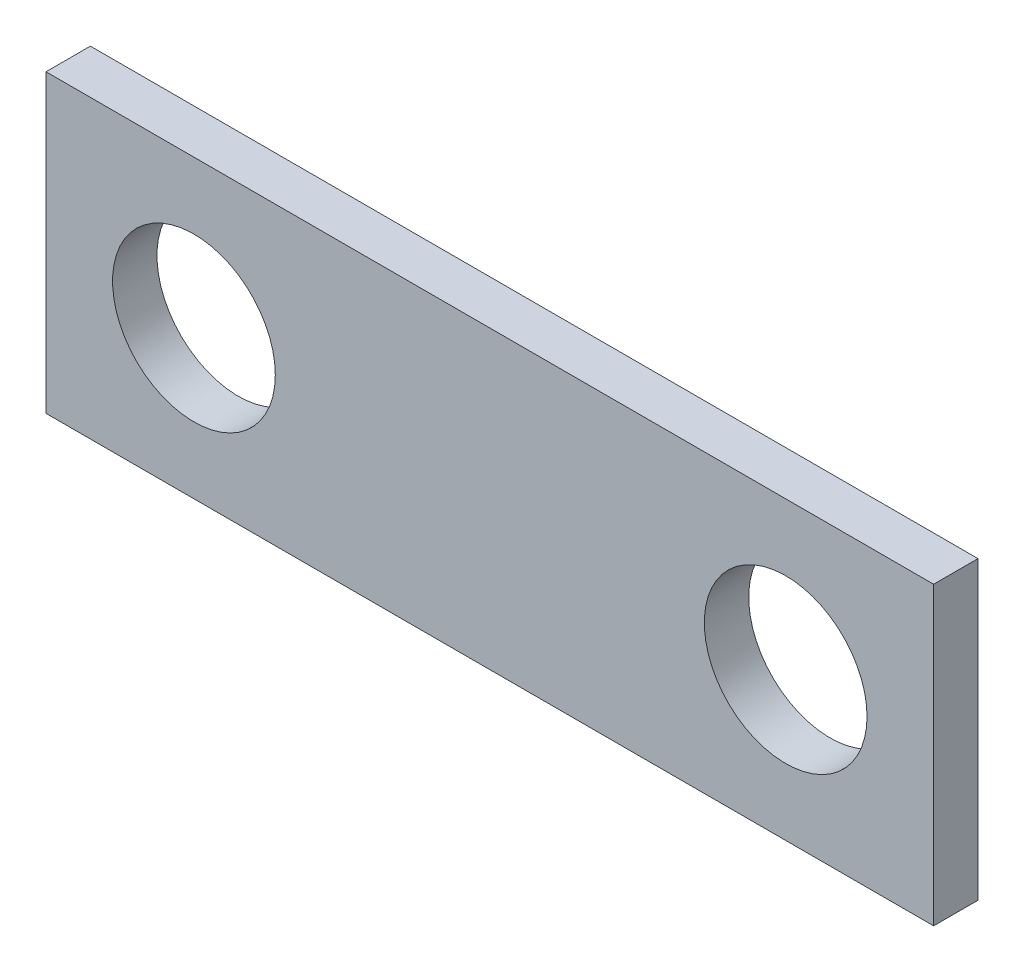
ISO-10303-21;
HEADER;
FILE_DESCRIPTION(('STEP AP214'),'2;1');
FILE_NAME('part.step','',(''),(''),'','','');
FILE_SCHEMA(('AUTOMOTIVE_DESIGN { 1 0 10303 214 1 1 1 1 }'));
ENDSEC;
DATA;
#1=APPLICATION_CONTEXT('core data for automotive mechanical design processes');
#2=APPLICATION_PROTOCOL_DEFINITION('international standard','automotive_design',2000,#1);
#3=PRODUCT_CONTEXT('',#1,'mechanical');
#4=PRODUCT('Part','Part','',(#3));
#5=PRODUCT_RELATED_PRODUCT_CATEGORY('part','',(#4));
#6=PRODUCT_DEFINITION_FORMATION('','',#4);
#7=PRODUCT_DEFINITION_CONTEXT('part definition',#1,'design');
#8=PRODUCT_DEFINITION('design','',#6,#7);
#9=PRODUCT_DEFINITION_SHAPE('','',#8);
#10=(LENGTH_UNIT() NAMED_UNIT(*) SI_UNIT(.MILLI.,.METRE.));
#11=(NAMED_UNIT(*) PLANE_ANGLE_UNIT() SI_UNIT($,.RADIAN.));
#12=(NAMED_UNIT(*) SI_UNIT($,.STERADIAN.) SOLID_ANGLE_UNIT());
#13=UNCERTAINTY_MEASURE_WITH_UNIT(LENGTH_MEASURE(1.E-05),#10,'distance_accuracy_value','');
#14=(GEOMETRIC_REPRESENTATION_CONTEXT(3) GLOBAL_UNCERTAINTY_ASSIGNED_CONTEXT((#13)) GLOBAL_UNIT_ASSIGNED_CONTEXT((#10,
#11,#12)) REPRESENTATION_CONTEXT('',''));
#15=CARTESIAN_POINT('',(0.,0.,0.));
#16=DIRECTION('',(0.,0.,1.));
#17=DIRECTION('',(1.,0.,0.));
#18=AXIS2_PLACEMENT_3D('',#15,#16,#17);
#19=CARTESIAN_POINT('',(30.,10.,3.));
#20=DIRECTION('',(-1.,0.,0.));
#21=DIRECTION('',(0.,0.,1.));
#22=AXIS2_PLACEMENT_3D('',#19,#20,#21);
#23=PLANE('',#22);
#24=DIRECTION('',(0.,1.,0.));
#25=VECTOR('',#24,1.);
#26=CARTESIAN_POINT('',(30.,10.,0.));
#27=LINE('',#26,#25);
#28=CARTESIAN_POINT('',(30.,-10.,0.));
#29=VERTEX_POINT('',#28);
#30=CARTESIAN_POINT('',(30.,10.,0.));
#31=VERTEX_POINT('',#30);
#32=EDGE_CURVE('E95',#29,#31,#27,.T.);
#33=ORIENTED_EDGE('',*,*,#32,.T.);
#34=DIRECTION('',(0.,0.,-1.));
#35=VECTOR('',#34,1.);
#36=CARTESIAN_POINT('',(30.,10.,3.));
#37=LINE('',#36,#35);
#38=CARTESIAN_POINT('',(30.,10.,3.));
#39=VERTEX_POINT('',#38);
#40=EDGE_CURVE('E11',#39,#31,#37,.T.);
#41=ORIENTED_EDGE('',*,*,#40,.F.);
#42=DIRECTION('',(0.,1.,0.));
#43=VECTOR('',#42,1.);
#44=CARTESIAN_POINT('',(30.,10.,3.));
#45=LINE('',#44,#43);
#46=CARTESIAN_POINT('',(30.,-10.,3.));
#47=VERTEX_POINT('',#46);
#48=EDGE_CURVE('E83',#47,#39,#45,.T.);
#49=ORIENTED_EDGE('',*,*,#48,.F.);
#50=DIRECTION('',(0.,0.,-1.));
#51=VECTOR('',#50,1.);
#52=CARTESIAN_POINT('',(30.,-10.,3.));
#53=LINE('',#52,#51);
#54=EDGE_CURVE('E91',#47,#29,#53,.T.);
#55=ORIENTED_EDGE('',*,*,#54,.T.);
#56=EDGE_LOOP('',(#33,#41,#49,#55));
#57=FACE_BOUND('',#56,.T.);
#58=ADVANCED_FACE('F32',(#57),#23,.F.);
#59=CARTESIAN_POINT('',(-30.,10.,3.));
#60=DIRECTION('',(0.,-1.,0.));
#61=DIRECTION('',(0.,0.,-1.));
#62=AXIS2_PLACEMENT_3D('',#59,#60,#61);
#63=PLANE('',#62);
#64=DIRECTION('',(-1.,0.,0.));
#65=VECTOR('',#64,1.);
#66=CARTESIAN_POINT('',(-30.,10.,0.));
#67=LINE('',#66,#65);
#68=CARTESIAN_POINT('',(-30.,10.,0.));
#69=VERTEX_POINT('',#68);
#70=EDGE_CURVE('E87',#31,#69,#67,.T.);
#71=ORIENTED_EDGE('',*,*,#70,.T.);
#72=DIRECTION('',(0.,0.,-1.));
#73=VECTOR('',#72,1.);
#74=CARTESIAN_POINT('',(-30.,10.,3.));
#75=LINE('',#74,#73);
#76=CARTESIAN_POINT('',(-30.,10.,3.));
#77=VERTEX_POINT('',#76);
#78=EDGE_CURVE('E40',#77,#69,#75,.T.);
#79=ORIENTED_EDGE('',*,*,#78,.F.);
#80=DIRECTION('',(-1.,0.,0.));
#81=VECTOR('',#80,1.);
#82=CARTESIAN_POINT('',(-30.,10.,3.));
#83=LINE('',#82,#81);
#84=EDGE_CURVE('E78',#39,#77,#83,.T.);
#85=ORIENTED_EDGE('',*,*,#84,.F.);
#86=ORIENTED_EDGE('',*,*,#40,.T.);
#87=EDGE_LOOP('',(#71,#79,#85,#86));
#88=FACE_BOUND('',#87,.T.);
#89=ADVANCED_FACE('F86',(#88),#63,.F.);
#90=CARTESIAN_POINT('',(-30.,10.,3.));
#91=DIRECTION('',(1.,0.,0.));
#92=DIRECTION('',(0.,1.,0.));
#93=AXIS2_PLACEMENT_3D('',#90,#91,#92);
#94=PLANE('',#93);
#95=DIRECTION('',(0.,-1.,0.));
#96=VECTOR('',#95,1.);
#97=CARTESIAN_POINT('',(-30.,10.,0.));
#98=LINE('',#97,#96);
#99=CARTESIAN_POINT('',(-30.,-10.,0.));
#100=VERTEX_POINT('',#99);
#101=EDGE_CURVE('E65',#69,#100,#98,.T.);
#102=ORIENTED_EDGE('',*,*,#101,.T.);
#103=DIRECTION('',(0.,0.,-1.));
#104=VECTOR('',#103,1.);
#105=CARTESIAN_POINT('',(-30.,-10.,3.));
#106=LINE('',#105,#104);
#107=CARTESIAN_POINT('',(-30.,-10.,3.));
#108=VERTEX_POINT('',#107);
#109=EDGE_CURVE('E88',#108,#100,#106,.T.);
#110=ORIENTED_EDGE('',*,*,#109,.F.);
#111=DIRECTION('',(0.,-1.,0.));
#112=VECTOR('',#111,1.);
#113=CARTESIAN_POINT('',(-30.,10.,3.));
#114=LINE('',#113,#112);
#115=EDGE_CURVE('E81',#77,#108,#114,.T.);
#116=ORIENTED_EDGE('',*,*,#115,.F.);
#117=ORIENTED_EDGE('',*,*,#78,.T.);
#118=EDGE_LOOP('',(#102,#110,#116,#117));
#119=FACE_BOUND('',#118,.T.);
#120=ADVANCED_FACE('F89',(#119),#94,.F.);
#121=CARTESIAN_POINT('',(-30.,-10.,3.));
#122=DIRECTION('',(0.,1.,0.));
#123=DIRECTION('',(0.,0.,1.));
#124=AXIS2_PLACEMENT_3D('',#121,#122,#123);
#125=PLANE('',#124);
#126=DIRECTION('',(1.,0.,0.));
#127=VECTOR('',#126,1.);
#128=CARTESIAN_POINT('',(-30.,-10.,0.));
#129=LINE('',#128,#127);
#130=EDGE_CURVE('E71',#100,#29,#129,.T.);
#131=ORIENTED_EDGE('',*,*,#130,.T.);
#132=ORIENTED_EDGE('',*,*,#54,.F.);
#133=DIRECTION('',(1.,0.,0.));
#134=VECTOR('',#133,1.);
#135=CARTESIAN_POINT('',(-30.,-10.,3.));
#136=LINE('',#135,#134);
#137=EDGE_CURVE('E48',#108,#47,#136,.T.);
#138=ORIENTED_EDGE('',*,*,#137,.F.);
#139=ORIENTED_EDGE('',*,*,#109,.T.);
#140=EDGE_LOOP('',(#131,#132,#138,#139));
#141=FACE_BOUND('',#140,.T.);
#142=ADVANCED_FACE('F103',(#141),#125,.F.);
#143=CARTESIAN_POINT('',(0.,0.,3.));
#144=DIRECTION('',(0.,0.,1.));
#145=DIRECTION('',(1.,0.,0.));
#146=AXIS2_PLACEMENT_3D('',#143,#144,#145);
#147=PLANE('',#146);
#148=CARTESIAN_POINT('',(20.,0.,3.));
#149=DIRECTION('',(0.,0.,1.));
#150=DIRECTION('',(1.,0.,0.));
#151=AXIS2_PLACEMENT_3D('',#148,#149,#150);
#152=CIRCLE('',#151,5.5);
#153=CARTESIAN_POINT('',(25.5,0.,3.));
#154=VERTEX_POINT('',#153);
#155=EDGE_CURVE('E115',#154,#154,#152,.T.);
#156=ORIENTED_EDGE('',*,*,#155,.F.);
#157=EDGE_LOOP('',(#156));
#158=FACE_BOUND('',#157,.T.);
#159=CARTESIAN_POINT('',(-20.,0.,3.));
#160=DIRECTION('',(0.,0.,1.));
#161=DIRECTION('',(1.,0.,0.));
#162=AXIS2_PLACEMENT_3D('',#159,#160,#161);
#163=CIRCLE('',#162,5.5);
#164=CARTESIAN_POINT('',(-14.5,0.,3.));
#165=VERTEX_POINT('',#164);
#166=EDGE_CURVE('E109',#165,#165,#163,.T.);
#167=ORIENTED_EDGE('',*,*,#166,.F.);
#168=EDGE_LOOP('',(#167));
#169=FACE_BOUND('',#168,.T.);
#170=ORIENTED_EDGE('',*,*,#48,.T.);
#171=ORIENTED_EDGE('',*,*,#84,.T.);
#172=ORIENTED_EDGE('',*,*,#115,.T.);
#173=ORIENTED_EDGE('',*,*,#137,.T.);
#174=EDGE_LOOP('',(#170,#171,#172,#173));
#175=FACE_BOUND('',#174,.T.);
#176=ADVANCED_FACE('F79',(#158,#169,#175),#147,.T.);
#177=CARTESIAN_POINT('',(0.,0.,0.));
#178=DIRECTION('',(0.,0.,1.));
#179=DIRECTION('',(1.,0.,0.));
#180=AXIS2_PLACEMENT_3D('',#177,#178,#179);
#181=PLANE('',#180);
#182=CARTESIAN_POINT('',(20.,0.,0.));
#183=DIRECTION('',(0.,0.,1.));
#184=DIRECTION('',(1.,0.,0.));
#185=AXIS2_PLACEMENT_3D('',#182,#183,#184);
#186=CIRCLE('',#185,5.5);
#187=CARTESIAN_POINT('',(25.5,0.,0.));
#188=VERTEX_POINT('',#187);
#189=EDGE_CURVE('E112',#188,#188,#186,.T.);
#190=ORIENTED_EDGE('',*,*,#189,.T.);
#191=EDGE_LOOP('',(#190));
#192=FACE_BOUND('',#191,.T.);
#193=CARTESIAN_POINT('',(-20.,0.,0.));
#194=DIRECTION('',(0.,0.,1.));
#195=DIRECTION('',(1.,0.,0.));
#196=AXIS2_PLACEMENT_3D('',#193,#194,#195);
#197=CIRCLE('',#196,5.5);
#198=CARTESIAN_POINT('',(-14.5,0.,0.));
#199=VERTEX_POINT('',#198);
#200=EDGE_CURVE('E98',#199,#199,#197,.T.);
#201=ORIENTED_EDGE('',*,*,#200,.T.);
#202=EDGE_LOOP('',(#201));
#203=FACE_BOUND('',#202,.T.);
#204=ORIENTED_EDGE('',*,*,#32,.F.);
#205=ORIENTED_EDGE('',*,*,#130,.F.);
#206=ORIENTED_EDGE('',*,*,#101,.F.);
#207=ORIENTED_EDGE('',*,*,#70,.F.);
#208=EDGE_LOOP('',(#204,#205,#206,#207));
#209=FACE_BOUND('',#208,.T.);
#210=ADVANCED_FACE('F106',(#192,#203,#209),#181,.F.);
#211=CARTESIAN_POINT('',(-20.,0.,0.));
#212=DIRECTION('',(0.,0.,1.));
#213=DIRECTION('',(1.,0.,0.));
#214=AXIS2_PLACEMENT_3D('',#211,#212,#213);
#215=CYLINDRICAL_SURFACE('',#214,5.5);
#216=ORIENTED_EDGE('',*,*,#200,.F.);
#217=EDGE_LOOP('',(#216));
#218=FACE_BOUND('',#217,.T.);
#219=ORIENTED_EDGE('',*,*,#166,.T.);
#220=EDGE_LOOP('',(#219));
#221=FACE_BOUND('',#220,.T.);
#222=ADVANCED_FACE('F126',(#218,#221),#215,.F.);
#223=CARTESIAN_POINT('',(20.,0.,0.));
#224=DIRECTION('',(0.,0.,1.));
#225=DIRECTION('',(1.,0.,0.));
#226=AXIS2_PLACEMENT_3D('',#223,#224,#225);
#227=CYLINDRICAL_SURFACE('',#226,5.5);
#228=ORIENTED_EDGE('',*,*,#189,.F.);
#229=EDGE_LOOP('',(#228));
#230=FACE_BOUND('',#229,.T.);
#231=ORIENTED_EDGE('',*,*,#155,.T.);
#232=EDGE_LOOP('',(#231));
#233=FACE_BOUND('',#232,.T.);
#234=ADVANCED_FACE('F123',(#230,#233),#227,.F.);
#235=CLOSED_SHELL('',(#58,#89,#120,#142,#176,#210,#222,#234));
#236=MANIFOLD_SOLID_BREP('B2',#235);
#237=ADVANCED_BREP_SHAPE_REPRESENTATION('',(#18,#236),#14);
#238=SHAPE_DEFINITION_REPRESENTATION(#9,#237);
ENDSEC;
END-ISO-10303-21;
